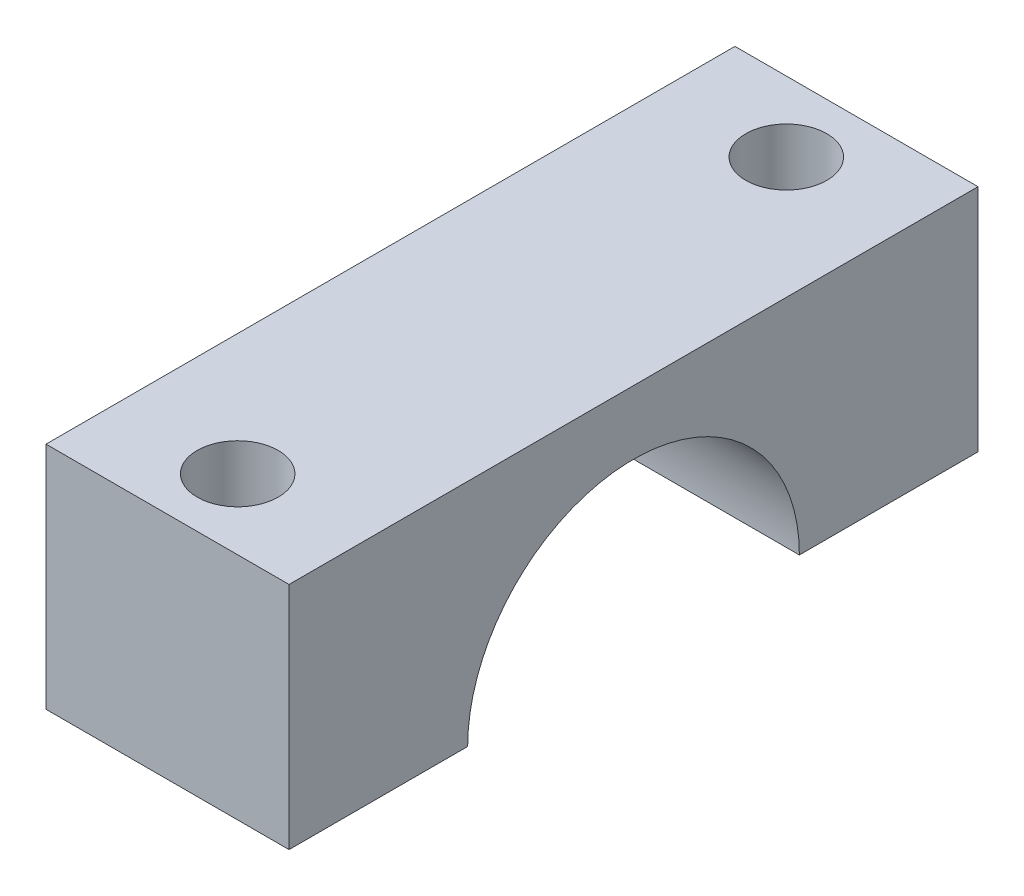
ISO-10303-21;
HEADER;
FILE_DESCRIPTION(('STEP AP214'),'2;1');
FILE_NAME('part.step','',(''),(''),'','','');
FILE_SCHEMA(('AUTOMOTIVE_DESIGN { 1 0 10303 214 1 1 1 1 }'));
ENDSEC;
DATA;
#1=APPLICATION_CONTEXT('core data for automotive mechanical design processes');
#2=APPLICATION_PROTOCOL_DEFINITION('international standard','automotive_design',2000,#1);
#3=PRODUCT_CONTEXT('',#1,'mechanical');
#4=PRODUCT('Part','Part','',(#3));
#5=PRODUCT_RELATED_PRODUCT_CATEGORY('part','',(#4));
#6=PRODUCT_DEFINITION_FORMATION('','',#4);
#7=PRODUCT_DEFINITION_CONTEXT('part definition',#1,'design');
#8=PRODUCT_DEFINITION('design','',#6,#7);
#9=PRODUCT_DEFINITION_SHAPE('','',#8);
#10=(LENGTH_UNIT() NAMED_UNIT(*) SI_UNIT(.MILLI.,.METRE.));
#11=(NAMED_UNIT(*) PLANE_ANGLE_UNIT() SI_UNIT($,.RADIAN.));
#12=(NAMED_UNIT(*) SI_UNIT($,.STERADIAN.) SOLID_ANGLE_UNIT());
#13=UNCERTAINTY_MEASURE_WITH_UNIT(LENGTH_MEASURE(1.E-05),#10,'distance_accuracy_value','');
#14=(GEOMETRIC_REPRESENTATION_CONTEXT(3) GLOBAL_UNCERTAINTY_ASSIGNED_CONTEXT((#13)) GLOBAL_UNIT_ASSIGNED_CONTEXT((#10,
#11,#12)) REPRESENTATION_CONTEXT('',''));
#15=CARTESIAN_POINT('',(0.,0.,0.));
#16=DIRECTION('',(0.,0.,1.));
#17=DIRECTION('',(1.,0.,0.));
#18=AXIS2_PLACEMENT_3D('',#15,#16,#17);
#19=CARTESIAN_POINT('',(9.525,9.,-13.5));
#20=DIRECTION('',(0.,0.,1.));
#21=DIRECTION('',(0.,-1.,0.));
#22=AXIS2_PLACEMENT_3D('',#19,#20,#21);
#23=PLANE('',#22);
#24=DIRECTION('',(0.,1.,0.));
#25=VECTOR('',#24,1.);
#26=CARTESIAN_POINT('',(0.,9.,-13.5));
#27=LINE('',#26,#25);
#28=CARTESIAN_POINT('',(0.,0.,-13.5));
#29=VERTEX_POINT('',#28);
#30=CARTESIAN_POINT('',(0.,9.,-13.5));
#31=VERTEX_POINT('',#30);
#32=EDGE_CURVE('E117',#29,#31,#27,.T.);
#33=ORIENTED_EDGE('',*,*,#32,.T.);
#34=DIRECTION('',(-1.,0.,0.));
#35=VECTOR('',#34,1.);
#36=CARTESIAN_POINT('',(9.525,9.,-13.5));
#37=LINE('',#36,#35);
#38=CARTESIAN_POINT('',(9.525,9.,-13.5));
#39=VERTEX_POINT('',#38);
#40=EDGE_CURVE('E11',#39,#31,#37,.T.);
#41=ORIENTED_EDGE('',*,*,#40,.F.);
#42=DIRECTION('',(0.,1.,0.));
#43=VECTOR('',#42,1.);
#44=CARTESIAN_POINT('',(9.525,9.,-13.5));
#45=LINE('',#44,#43);
#46=CARTESIAN_POINT('',(9.525,0.,-13.5));
#47=VERTEX_POINT('',#46);
#48=EDGE_CURVE('E128',#47,#39,#45,.T.);
#49=ORIENTED_EDGE('',*,*,#48,.F.);
#50=DIRECTION('',(-1.,0.,0.));
#51=VECTOR('',#50,1.);
#52=CARTESIAN_POINT('',(9.525,0.,-13.5));
#53=LINE('',#52,#51);
#54=EDGE_CURVE('E113',#47,#29,#53,.T.);
#55=ORIENTED_EDGE('',*,*,#54,.T.);
#56=EDGE_LOOP('',(#33,#41,#49,#55));
#57=FACE_BOUND('',#56,.T.);
#58=ADVANCED_FACE('F33',(#57),#23,.F.);
#59=CARTESIAN_POINT('',(9.525,9.,-13.5));
#60=DIRECTION('',(0.,-1.,0.));
#61=DIRECTION('',(0.,0.,-1.));
#62=AXIS2_PLACEMENT_3D('',#59,#60,#61);
#63=PLANE('',#62);
#64=CARTESIAN_POINT('',(4.7625,9.,-10.75));
#65=DIRECTION('',(0.,1.,0.));
#66=DIRECTION('',(0.,0.,1.));
#67=AXIS2_PLACEMENT_3D('',#64,#65,#66);
#68=CIRCLE('',#67,1.5875);
#69=CARTESIAN_POINT('',(4.7625,9.,-9.1625));
#70=VERTEX_POINT('',#69);
#71=EDGE_CURVE('E179',#70,#70,#68,.T.);
#72=ORIENTED_EDGE('',*,*,#71,.F.);
#73=EDGE_LOOP('',(#72));
#74=FACE_BOUND('',#73,.T.);
#75=CARTESIAN_POINT('',(4.7625,9.,10.75));
#76=DIRECTION('',(0.,1.,0.));
#77=DIRECTION('',(0.,0.,1.));
#78=AXIS2_PLACEMENT_3D('',#75,#76,#77);
#79=CIRCLE('',#78,1.5875);
#80=CARTESIAN_POINT('',(4.7625,9.,12.3375));
#81=VERTEX_POINT('',#80);
#82=EDGE_CURVE('E173',#81,#81,#79,.T.);
#83=ORIENTED_EDGE('',*,*,#82,.F.);
#84=EDGE_LOOP('',(#83));
#85=FACE_BOUND('',#84,.T.);
#86=DIRECTION('',(0.,0.,1.));
#87=VECTOR('',#86,1.);
#88=CARTESIAN_POINT('',(0.,9.,-13.5));
#89=LINE('',#88,#87);
#90=CARTESIAN_POINT('',(0.,9.,13.5));
#91=VERTEX_POINT('',#90);
#92=EDGE_CURVE('E120',#31,#91,#89,.T.);
#93=ORIENTED_EDGE('',*,*,#92,.T.);
#94=DIRECTION('',(-1.,0.,0.));
#95=VECTOR('',#94,1.);
#96=CARTESIAN_POINT('',(9.525,9.,13.5));
#97=LINE('',#96,#95);
#98=CARTESIAN_POINT('',(9.525,9.,13.5));
#99=VERTEX_POINT('',#98);
#100=EDGE_CURVE('E41',#99,#91,#97,.T.);
#101=ORIENTED_EDGE('',*,*,#100,.F.);
#102=DIRECTION('',(0.,0.,1.));
#103=VECTOR('',#102,1.);
#104=CARTESIAN_POINT('',(9.525,9.,-13.5));
#105=LINE('',#104,#103);
#106=EDGE_CURVE('E86',#39,#99,#105,.T.);
#107=ORIENTED_EDGE('',*,*,#106,.F.);
#108=ORIENTED_EDGE('',*,*,#40,.T.);
#109=EDGE_LOOP('',(#93,#101,#107,#108));
#110=FACE_BOUND('',#109,.T.);
#111=ADVANCED_FACE('F154',(#74,#85,#110),#63,.F.);
#112=CARTESIAN_POINT('',(9.525,9.,13.5));
#113=DIRECTION('',(0.,0.,-1.));
#114=DIRECTION('',(-1.,0.,0.));
#115=AXIS2_PLACEMENT_3D('',#112,#113,#114);
#116=PLANE('',#115);
#117=DIRECTION('',(0.,-1.,0.));
#118=VECTOR('',#117,1.);
#119=CARTESIAN_POINT('',(0.,9.,13.5));
#120=LINE('',#119,#118);
#121=CARTESIAN_POINT('',(0.,0.,13.5));
#122=VERTEX_POINT('',#121);
#123=EDGE_CURVE('E123',#91,#122,#120,.T.);
#124=ORIENTED_EDGE('',*,*,#123,.T.);
#125=DIRECTION('',(-1.,0.,0.));
#126=VECTOR('',#125,1.);
#127=CARTESIAN_POINT('',(9.525,0.,13.5));
#128=LINE('',#127,#126);
#129=CARTESIAN_POINT('',(9.525,0.,13.5));
#130=VERTEX_POINT('',#129);
#131=EDGE_CURVE('E108',#130,#122,#128,.T.);
#132=ORIENTED_EDGE('',*,*,#131,.F.);
#133=DIRECTION('',(0.,-1.,0.));
#134=VECTOR('',#133,1.);
#135=CARTESIAN_POINT('',(9.525,9.,13.5));
#136=LINE('',#135,#134);
#137=EDGE_CURVE('E99',#99,#130,#136,.T.);
#138=ORIENTED_EDGE('',*,*,#137,.F.);
#139=ORIENTED_EDGE('',*,*,#100,.T.);
#140=EDGE_LOOP('',(#124,#132,#138,#139));
#141=FACE_BOUND('',#140,.T.);
#142=ADVANCED_FACE('F134',(#141),#116,.F.);
#143=CARTESIAN_POINT('',(9.525,0.,6.5));
#144=DIRECTION('',(0.,1.,0.));
#145=DIRECTION('',(0.,0.,1.));
#146=AXIS2_PLACEMENT_3D('',#143,#144,#145);
#147=PLANE('',#146);
#148=CARTESIAN_POINT('',(4.7625,0.,10.75));
#149=DIRECTION('',(0.,1.,0.));
#150=DIRECTION('',(0.,0.,1.));
#151=AXIS2_PLACEMENT_3D('',#148,#149,#150);
#152=CIRCLE('',#151,1.5875);
#153=CARTESIAN_POINT('',(4.7625,0.,12.3375));
#154=VERTEX_POINT('',#153);
#155=EDGE_CURVE('E121',#154,#154,#152,.T.);
#156=ORIENTED_EDGE('',*,*,#155,.T.);
#157=EDGE_LOOP('',(#156));
#158=FACE_BOUND('',#157,.T.);
#159=DIRECTION('',(0.,0.,-1.));
#160=VECTOR('',#159,1.);
#161=CARTESIAN_POINT('',(0.,0.,6.5));
#162=LINE('',#161,#160);
#163=CARTESIAN_POINT('',(0.,0.,6.5));
#164=VERTEX_POINT('',#163);
#165=EDGE_CURVE('E107',#122,#164,#162,.T.);
#166=ORIENTED_EDGE('',*,*,#165,.T.);
#167=DIRECTION('',(-1.,0.,0.));
#168=VECTOR('',#167,1.);
#169=CARTESIAN_POINT('',(9.525,0.,6.5));
#170=LINE('',#169,#168);
#171=CARTESIAN_POINT('',(9.525,0.,6.5));
#172=VERTEX_POINT('',#171);
#173=EDGE_CURVE('E104',#172,#164,#170,.T.);
#174=ORIENTED_EDGE('',*,*,#173,.F.);
#175=DIRECTION('',(0.,0.,-1.));
#176=VECTOR('',#175,1.);
#177=CARTESIAN_POINT('',(9.525,0.,6.5));
#178=LINE('',#177,#176);
#179=EDGE_CURVE('E93',#130,#172,#178,.T.);
#180=ORIENTED_EDGE('',*,*,#179,.F.);
#181=ORIENTED_EDGE('',*,*,#131,.T.);
#182=EDGE_LOOP('',(#166,#174,#180,#181));
#183=FACE_BOUND('',#182,.T.);
#184=ADVANCED_FACE('F105',(#158,#183),#147,.F.);
#185=CARTESIAN_POINT('',(9.525,0.,0.));
#186=DIRECTION('',(-1.,0.,0.));
#187=DIRECTION('',(0.,0.,1.));
#188=AXIS2_PLACEMENT_3D('',#185,#186,#187);
#189=CYLINDRICAL_SURFACE('',#188,6.5);
#190=CARTESIAN_POINT('',(0.,0.,0.));
#191=DIRECTION('',(-1.,0.,0.));
#192=DIRECTION('',(0.,0.,-1.));
#193=AXIS2_PLACEMENT_3D('',#190,#191,#192);
#194=CIRCLE('',#193,6.5);
#195=CARTESIAN_POINT('',(0.,0.,-6.5));
#196=VERTEX_POINT('',#195);
#197=EDGE_CURVE('E72',#164,#196,#194,.T.);
#198=ORIENTED_EDGE('',*,*,#197,.T.);
#199=DIRECTION('',(-1.,0.,0.));
#200=VECTOR('',#199,1.);
#201=CARTESIAN_POINT('',(9.525,0.,-6.5));
#202=LINE('',#201,#200);
#203=CARTESIAN_POINT('',(9.525,0.,-6.5));
#204=VERTEX_POINT('',#203);
#205=EDGE_CURVE('E109',#204,#196,#202,.T.);
#206=ORIENTED_EDGE('',*,*,#205,.F.);
#207=CARTESIAN_POINT('',(9.525,0.,0.));
#208=DIRECTION('',(-1.,0.,0.));
#209=DIRECTION('',(0.,0.,-1.));
#210=AXIS2_PLACEMENT_3D('',#207,#208,#209);
#211=CIRCLE('',#210,6.5);
#212=EDGE_CURVE('E97',#172,#204,#211,.T.);
#213=ORIENTED_EDGE('',*,*,#212,.F.);
#214=ORIENTED_EDGE('',*,*,#173,.T.);
#215=EDGE_LOOP('',(#198,#206,#213,#214));
#216=FACE_BOUND('',#215,.T.);
#217=ADVANCED_FACE('F111',(#216),#189,.F.);
#218=CARTESIAN_POINT('',(9.525,0.,-13.5));
#219=DIRECTION('',(0.,1.,0.));
#220=DIRECTION('',(0.,0.,1.));
#221=AXIS2_PLACEMENT_3D('',#218,#219,#220);
#222=PLANE('',#221);
#223=CARTESIAN_POINT('',(4.7625,0.,-10.75));
#224=DIRECTION('',(0.,1.,0.));
#225=DIRECTION('',(0.,0.,1.));
#226=AXIS2_PLACEMENT_3D('',#223,#224,#225);
#227=CIRCLE('',#226,1.5875);
#228=CARTESIAN_POINT('',(4.7625,0.,-9.1625));
#229=VERTEX_POINT('',#228);
#230=EDGE_CURVE('E176',#229,#229,#227,.T.);
#231=ORIENTED_EDGE('',*,*,#230,.T.);
#232=EDGE_LOOP('',(#231));
#233=FACE_BOUND('',#232,.T.);
#234=DIRECTION('',(0.,0.,-1.));
#235=VECTOR('',#234,1.);
#236=CARTESIAN_POINT('',(0.,0.,-13.5));
#237=LINE('',#236,#235);
#238=EDGE_CURVE('E78',#196,#29,#237,.T.);
#239=ORIENTED_EDGE('',*,*,#238,.T.);
#240=ORIENTED_EDGE('',*,*,#54,.F.);
#241=DIRECTION('',(0.,0.,-1.));
#242=VECTOR('',#241,1.);
#243=CARTESIAN_POINT('',(9.525,0.,-13.5));
#244=LINE('',#243,#242);
#245=EDGE_CURVE('E49',#204,#47,#244,.T.);
#246=ORIENTED_EDGE('',*,*,#245,.F.);
#247=ORIENTED_EDGE('',*,*,#205,.T.);
#248=EDGE_LOOP('',(#239,#240,#246,#247));
#249=FACE_BOUND('',#248,.T.);
#250=ADVANCED_FACE('F141',(#233,#249),#222,.F.);
#251=CARTESIAN_POINT('',(9.525,0.,0.));
#252=DIRECTION('',(1.,0.,0.));
#253=DIRECTION('',(0.,0.,-1.));
#254=AXIS2_PLACEMENT_3D('',#251,#252,#253);
#255=PLANE('',#254);
#256=ORIENTED_EDGE('',*,*,#48,.T.);
#257=ORIENTED_EDGE('',*,*,#106,.T.);
#258=ORIENTED_EDGE('',*,*,#137,.T.);
#259=ORIENTED_EDGE('',*,*,#179,.T.);
#260=ORIENTED_EDGE('',*,*,#212,.T.);
#261=ORIENTED_EDGE('',*,*,#245,.T.);
#262=EDGE_LOOP('',(#256,#257,#258,#259,#260,#261));
#263=FACE_BOUND('',#262,.T.);
#264=ADVANCED_FACE('F95',(#263),#255,.T.);
#265=CARTESIAN_POINT('',(0.,0.,0.));
#266=DIRECTION('',(1.,0.,0.));
#267=DIRECTION('',(0.,0.,-1.));
#268=AXIS2_PLACEMENT_3D('',#265,#266,#267);
#269=PLANE('',#268);
#270=ORIENTED_EDGE('',*,*,#32,.F.);
#271=ORIENTED_EDGE('',*,*,#238,.F.);
#272=ORIENTED_EDGE('',*,*,#197,.F.);
#273=ORIENTED_EDGE('',*,*,#165,.F.);
#274=ORIENTED_EDGE('',*,*,#123,.F.);
#275=ORIENTED_EDGE('',*,*,#92,.F.);
#276=EDGE_LOOP('',(#270,#271,#272,#273,#274,#275));
#277=FACE_BOUND('',#276,.T.);
#278=ADVANCED_FACE('F137',(#277),#269,.F.);
#279=CARTESIAN_POINT('',(4.7625,0.,10.75));
#280=DIRECTION('',(0.,1.,0.));
#281=DIRECTION('',(0.,0.,1.));
#282=AXIS2_PLACEMENT_3D('',#279,#280,#281);
#283=CYLINDRICAL_SURFACE('',#282,1.5875);
#284=ORIENTED_EDGE('',*,*,#155,.F.);
#285=EDGE_LOOP('',(#284));
#286=FACE_BOUND('',#285,.T.);
#287=ORIENTED_EDGE('',*,*,#82,.T.);
#288=EDGE_LOOP('',(#287));
#289=FACE_BOUND('',#288,.T.);
#290=ADVANCED_FACE('F189',(#286,#289),#283,.F.);
#291=CARTESIAN_POINT('',(4.7625,0.,-10.75));
#292=DIRECTION('',(0.,1.,0.));
#293=DIRECTION('',(0.,0.,1.));
#294=AXIS2_PLACEMENT_3D('',#291,#292,#293);
#295=CYLINDRICAL_SURFACE('',#294,1.5875);
#296=ORIENTED_EDGE('',*,*,#230,.F.);
#297=EDGE_LOOP('',(#296));
#298=FACE_BOUND('',#297,.T.);
#299=ORIENTED_EDGE('',*,*,#71,.T.);
#300=EDGE_LOOP('',(#299));
#301=FACE_BOUND('',#300,.T.);
#302=ADVANCED_FACE('F186',(#298,#301),#295,.F.);
#303=CLOSED_SHELL('',(#58,#111,#142,#184,#217,#250,#264,#278,#290,#302));
#304=MANIFOLD_SOLID_BREP('B2',#303);
#305=ADVANCED_BREP_SHAPE_REPRESENTATION('',(#18,#304),#14);
#306=SHAPE_DEFINITION_REPRESENTATION(#9,#305);
ENDSEC;
END-ISO-10303-21;
